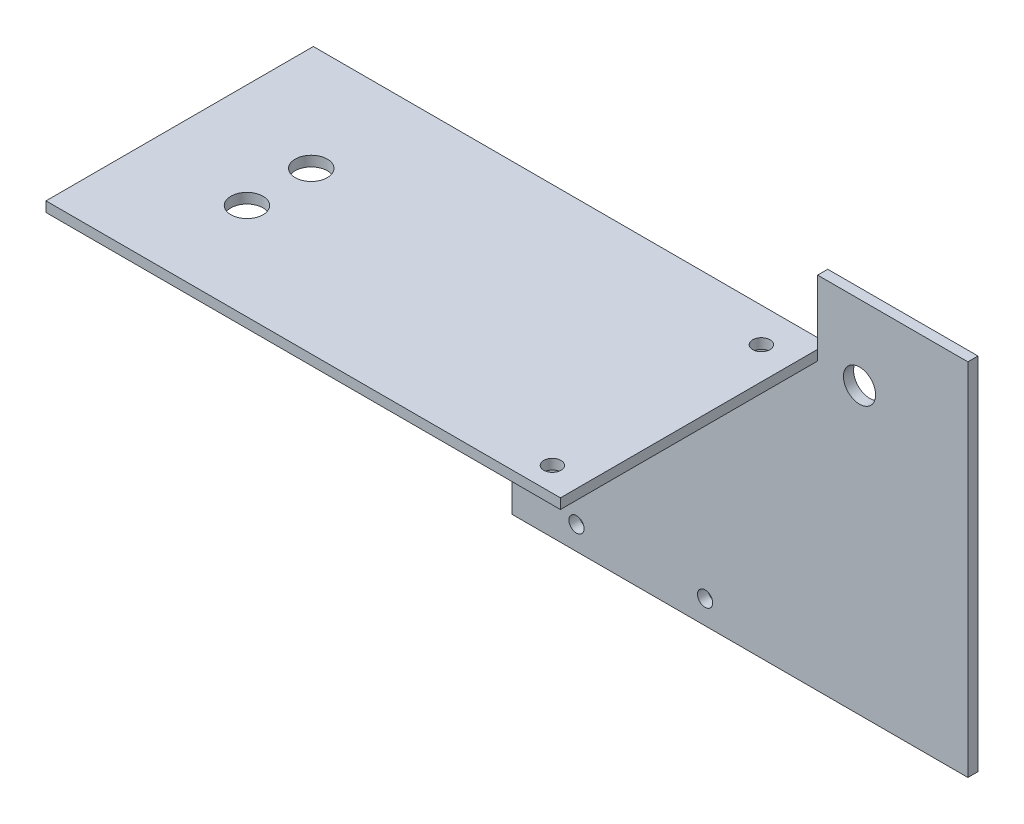
ISO-10303-21;
HEADER;
FILE_DESCRIPTION(('STEP AP214'),'2;1');
FILE_NAME('part.step','',(''),(''),'','','');
FILE_SCHEMA(('AUTOMOTIVE_DESIGN { 1 0 10303 214 1 1 1 1 }'));
ENDSEC;
DATA;
#1=APPLICATION_CONTEXT('core data for automotive mechanical design processes');
#2=APPLICATION_PROTOCOL_DEFINITION('international standard','automotive_design',2000,#1);
#3=PRODUCT_CONTEXT('',#1,'mechanical');
#4=PRODUCT('Part','Part','',(#3));
#5=PRODUCT_RELATED_PRODUCT_CATEGORY('part','',(#4));
#6=PRODUCT_DEFINITION_FORMATION('','',#4);
#7=PRODUCT_DEFINITION_CONTEXT('part definition',#1,'design');
#8=PRODUCT_DEFINITION('design','',#6,#7);
#9=PRODUCT_DEFINITION_SHAPE('','',#8);
#10=(LENGTH_UNIT() NAMED_UNIT(*) SI_UNIT(.MILLI.,.METRE.));
#11=(NAMED_UNIT(*) PLANE_ANGLE_UNIT() SI_UNIT($,.RADIAN.));
#12=(NAMED_UNIT(*) SI_UNIT($,.STERADIAN.) SOLID_ANGLE_UNIT());
#13=UNCERTAINTY_MEASURE_WITH_UNIT(LENGTH_MEASURE(1.E-05),#10,'distance_accuracy_value','');
#14=(GEOMETRIC_REPRESENTATION_CONTEXT(3) GLOBAL_UNCERTAINTY_ASSIGNED_CONTEXT((#13)) GLOBAL_UNIT_ASSIGNED_CONTEXT((#10,
#11,#12)) REPRESENTATION_CONTEXT('',''));
#15=CARTESIAN_POINT('',(0.,0.,0.));
#16=DIRECTION('',(0.,0.,1.));
#17=DIRECTION('',(1.,0.,0.));
#18=AXIS2_PLACEMENT_3D('',#15,#16,#17);
#19=CARTESIAN_POINT('',(0.,58.4,-2.));
#20=DIRECTION('',(-1.,0.,0.));
#21=DIRECTION('',(0.,0.,1.));
#22=AXIS2_PLACEMENT_3D('',#19,#20,#21);
#23=PLANE('',#22);
#24=DIRECTION('',(0.,0.,1.));
#25=VECTOR('',#24,1.);
#26=CARTESIAN_POINT('',(0.,56.4,-2.));
#27=LINE('',#26,#25);
#28=CARTESIAN_POINT('',(0.,56.4,-2.));
#29=VERTEX_POINT('',#28);
#30=CARTESIAN_POINT('',(0.,56.4,0.));
#31=VERTEX_POINT('',#30);
#32=EDGE_CURVE('E50',#29,#31,#27,.T.);
#33=ORIENTED_EDGE('',*,*,#32,.F.);
#34=DIRECTION('',(0.,-1.,0.));
#35=VECTOR('',#34,1.);
#36=CARTESIAN_POINT('',(0.,58.4,-2.));
#37=LINE('',#36,#35);
#38=CARTESIAN_POINT('',(0.,0.,-2.));
#39=VERTEX_POINT('',#38);
#40=EDGE_CURVE('E179',#29,#39,#37,.T.);
#41=ORIENTED_EDGE('',*,*,#40,.T.);
#42=DIRECTION('',(0.,0.,1.));
#43=VECTOR('',#42,1.);
#44=CARTESIAN_POINT('',(0.,0.,-2.));
#45=LINE('',#44,#43);
#46=CARTESIAN_POINT('',(0.,0.,0.));
#47=VERTEX_POINT('',#46);
#48=EDGE_CURVE('E195',#39,#47,#45,.T.);
#49=ORIENTED_EDGE('',*,*,#48,.T.);
#50=DIRECTION('',(0.,-1.,0.));
#51=VECTOR('',#50,1.);
#52=CARTESIAN_POINT('',(0.,58.4,0.));
#53=LINE('',#52,#51);
#54=EDGE_CURVE('E176',#31,#47,#53,.T.);
#55=ORIENTED_EDGE('',*,*,#54,.F.);
#56=EDGE_LOOP('',(#33,#41,#49,#55));
#57=FACE_BOUND('',#56,.T.);
#58=ADVANCED_FACE('F34',(#57),#23,.T.);
#59=CARTESIAN_POINT('',(0.,58.4,-2.));
#60=DIRECTION('',(0.,1.,0.));
#61=DIRECTION('',(0.,0.,1.));
#62=AXIS2_PLACEMENT_3D('',#59,#60,#61);
#63=PLANE('',#62);
#64=CARTESIAN_POINT('',(53.975,58.4,46.0375));
#65=DIRECTION('',(0.,1.,0.));
#66=DIRECTION('',(0.,0.,1.));
#67=AXIS2_PLACEMENT_3D('',#64,#65,#66);
#68=CIRCLE('',#67,1.7);
#69=CARTESIAN_POINT('',(53.975,58.4,47.7375));
#70=VERTEX_POINT('',#69);
#71=EDGE_CURVE('E225',#70,#70,#68,.T.);
#72=ORIENTED_EDGE('',*,*,#71,.F.);
#73=EDGE_LOOP('',(#72));
#74=FACE_BOUND('',#73,.T.);
#75=CARTESIAN_POINT('',(-20.6375,58.4,31.75));
#76=DIRECTION('',(0.,1.,0.));
#77=DIRECTION('',(0.,0.,1.));
#78=AXIS2_PLACEMENT_3D('',#75,#76,#77);
#79=CIRCLE('',#78,3.175);
#80=CARTESIAN_POINT('',(-20.6375,58.4,34.925));
#81=VERTEX_POINT('',#80);
#82=EDGE_CURVE('E239',#81,#81,#79,.T.);
#83=ORIENTED_EDGE('',*,*,#82,.F.);
#84=EDGE_LOOP('',(#83));
#85=FACE_BOUND('',#84,.T.);
#86=CARTESIAN_POINT('',(-20.6375,58.4,19.05));
#87=DIRECTION('',(0.,1.,0.));
#88=DIRECTION('',(0.,0.,1.));
#89=AXIS2_PLACEMENT_3D('',#86,#87,#88);
#90=CIRCLE('',#89,3.175);
#91=CARTESIAN_POINT('',(-20.6375,58.4,22.225));
#92=VERTEX_POINT('',#91);
#93=EDGE_CURVE('E236',#92,#92,#90,.T.);
#94=ORIENTED_EDGE('',*,*,#93,.F.);
#95=EDGE_LOOP('',(#94));
#96=FACE_BOUND('',#95,.T.);
#97=CARTESIAN_POINT('',(53.975,58.4,4.7625));
#98=DIRECTION('',(0.,1.,0.));
#99=DIRECTION('',(0.,0.,1.));
#100=AXIS2_PLACEMENT_3D('',#97,#98,#99);
#101=CIRCLE('',#100,1.7);
#102=CARTESIAN_POINT('',(53.975,58.4,6.4625));
#103=VERTEX_POINT('',#102);
#104=EDGE_CURVE('E221',#103,#103,#101,.T.);
#105=ORIENTED_EDGE('',*,*,#104,.F.);
#106=EDGE_LOOP('',(#105));
#107=FACE_BOUND('',#106,.T.);
#108=DIRECTION('',(-1.,0.,0.));
#109=VECTOR('',#108,1.);
#110=CARTESIAN_POINT('',(0.,58.4,-2.));
#111=LINE('',#110,#109);
#112=CARTESIAN_POINT('',(60.325,58.4,-2.));
#113=VERTEX_POINT('',#112);
#114=CARTESIAN_POINT('',(-41.275,58.4,-2.));
#115=VERTEX_POINT('',#114);
#116=EDGE_CURVE('E193',#113,#115,#111,.T.);
#117=ORIENTED_EDGE('',*,*,#116,.T.);
#118=DIRECTION('',(0.,0.,-1.));
#119=VECTOR('',#118,1.);
#120=CARTESIAN_POINT('',(-41.275,58.4,50.8));
#121=LINE('',#120,#119);
#122=CARTESIAN_POINT('',(-41.275,58.4,50.8));
#123=VERTEX_POINT('',#122);
#124=EDGE_CURVE('E114',#123,#115,#121,.T.);
#125=ORIENTED_EDGE('',*,*,#124,.F.);
#126=DIRECTION('',(1.,0.,0.));
#127=VECTOR('',#126,1.);
#128=CARTESIAN_POINT('',(-41.275,58.4,50.8));
#129=LINE('',#128,#127);
#130=CARTESIAN_POINT('',(60.325,58.4,50.8));
#131=VERTEX_POINT('',#130);
#132=EDGE_CURVE('E109',#123,#131,#129,.T.);
#133=ORIENTED_EDGE('',*,*,#132,.T.);
#134=DIRECTION('',(0.,0.,-1.));
#135=VECTOR('',#134,1.);
#136=CARTESIAN_POINT('',(60.325,58.4,50.8));
#137=LINE('',#136,#135);
#138=CARTESIAN_POINT('',(60.325,58.4,0.));
#139=VERTEX_POINT('',#138);
#140=EDGE_CURVE('E112',#131,#139,#137,.T.);
#141=ORIENTED_EDGE('',*,*,#140,.T.);
#142=DIRECTION('',(0.,0.,1.));
#143=VECTOR('',#142,1.);
#144=CARTESIAN_POINT('',(60.325,58.4,-2.));
#145=LINE('',#144,#143);
#146=EDGE_CURVE('E207',#113,#139,#145,.T.);
#147=ORIENTED_EDGE('',*,*,#146,.F.);
#148=EDGE_LOOP('',(#117,#125,#133,#141,#147));
#149=FACE_BOUND('',#148,.T.);
#150=ADVANCED_FACE('F111',(#74,#85,#96,#107,#149),#63,.T.);
#151=CARTESIAN_POINT('',(60.325,71.1,-2.));
#152=DIRECTION('',(-1.,0.,0.));
#153=DIRECTION('',(0.,0.,1.));
#154=AXIS2_PLACEMENT_3D('',#151,#152,#153);
#155=PLANE('',#154);
#156=DIRECTION('',(0.,-1.,0.));
#157=VECTOR('',#156,1.);
#158=CARTESIAN_POINT('',(60.325,71.1,0.));
#159=LINE('',#158,#157);
#160=CARTESIAN_POINT('',(60.325,71.1,0.));
#161=VERTEX_POINT('',#160);
#162=EDGE_CURVE('E182',#161,#139,#159,.T.);
#163=ORIENTED_EDGE('',*,*,#162,.F.);
#164=DIRECTION('',(0.,0.,1.));
#165=VECTOR('',#164,1.);
#166=CARTESIAN_POINT('',(60.325,71.1,-2.));
#167=LINE('',#166,#165);
#168=CARTESIAN_POINT('',(60.325,71.1,-2.));
#169=VERTEX_POINT('',#168);
#170=EDGE_CURVE('E209',#169,#161,#167,.T.);
#171=ORIENTED_EDGE('',*,*,#170,.F.);
#172=DIRECTION('',(0.,-1.,0.));
#173=VECTOR('',#172,1.);
#174=CARTESIAN_POINT('',(60.325,71.1,-2.));
#175=LINE('',#174,#173);
#176=EDGE_CURVE('E190',#169,#113,#175,.T.);
#177=ORIENTED_EDGE('',*,*,#176,.T.);
#178=ORIENTED_EDGE('',*,*,#146,.T.);
#179=EDGE_LOOP('',(#163,#171,#177,#178));
#180=FACE_BOUND('',#179,.T.);
#181=ADVANCED_FACE('F249',(#180),#155,.T.);
#182=CARTESIAN_POINT('',(90.,71.1,-2.));
#183=DIRECTION('',(0.,1.,0.));
#184=DIRECTION('',(0.,0.,1.));
#185=AXIS2_PLACEMENT_3D('',#182,#183,#184);
#186=PLANE('',#185);
#187=DIRECTION('',(-1.,0.,0.));
#188=VECTOR('',#187,1.);
#189=CARTESIAN_POINT('',(90.,71.1,0.));
#190=LINE('',#189,#188);
#191=CARTESIAN_POINT('',(90.,71.1,0.));
#192=VERTEX_POINT('',#191);
#193=EDGE_CURVE('E203',#192,#161,#190,.T.);
#194=ORIENTED_EDGE('',*,*,#193,.F.);
#195=DIRECTION('',(0.,0.,1.));
#196=VECTOR('',#195,1.);
#197=CARTESIAN_POINT('',(90.,71.1,-2.));
#198=LINE('',#197,#196);
#199=CARTESIAN_POINT('',(90.,71.1,-2.));
#200=VERTEX_POINT('',#199);
#201=EDGE_CURVE('E211',#200,#192,#198,.T.);
#202=ORIENTED_EDGE('',*,*,#201,.F.);
#203=DIRECTION('',(-1.,0.,0.));
#204=VECTOR('',#203,1.);
#205=CARTESIAN_POINT('',(90.,71.1,-2.));
#206=LINE('',#205,#204);
#207=EDGE_CURVE('E187',#200,#169,#206,.T.);
#208=ORIENTED_EDGE('',*,*,#207,.T.);
#209=ORIENTED_EDGE('',*,*,#170,.T.);
#210=EDGE_LOOP('',(#194,#202,#208,#209));
#211=FACE_BOUND('',#210,.T.);
#212=ADVANCED_FACE('F285',(#211),#186,.T.);
#213=CARTESIAN_POINT('',(90.,58.4,-2.));
#214=DIRECTION('',(1.,0.,0.));
#215=DIRECTION('',(0.,1.,0.));
#216=AXIS2_PLACEMENT_3D('',#213,#214,#215);
#217=PLANE('',#216);
#218=DIRECTION('',(0.,1.,0.));
#219=VECTOR('',#218,1.);
#220=CARTESIAN_POINT('',(90.,58.4,0.));
#221=LINE('',#220,#219);
#222=CARTESIAN_POINT('',(90.,0.,0.));
#223=VERTEX_POINT('',#222);
#224=EDGE_CURVE('E200',#223,#192,#221,.T.);
#225=ORIENTED_EDGE('',*,*,#224,.F.);
#226=DIRECTION('',(0.,0.,1.));
#227=VECTOR('',#226,1.);
#228=CARTESIAN_POINT('',(90.,0.,-2.));
#229=LINE('',#228,#227);
#230=CARTESIAN_POINT('',(90.,0.,-2.));
#231=VERTEX_POINT('',#230);
#232=EDGE_CURVE('E213',#231,#223,#229,.T.);
#233=ORIENTED_EDGE('',*,*,#232,.F.);
#234=DIRECTION('',(0.,1.,0.));
#235=VECTOR('',#234,1.);
#236=CARTESIAN_POINT('',(90.,58.4,-2.));
#237=LINE('',#236,#235);
#238=EDGE_CURVE('E185',#231,#200,#237,.T.);
#239=ORIENTED_EDGE('',*,*,#238,.T.);
#240=ORIENTED_EDGE('',*,*,#201,.T.);
#241=EDGE_LOOP('',(#225,#233,#239,#240));
#242=FACE_BOUND('',#241,.T.);
#243=ADVANCED_FACE('F294',(#242),#217,.T.);
#244=CARTESIAN_POINT('',(0.,0.,-2.));
#245=DIRECTION('',(0.,-1.,0.));
#246=DIRECTION('',(0.,0.,-1.));
#247=AXIS2_PLACEMENT_3D('',#244,#245,#246);
#248=PLANE('',#247);
#249=DIRECTION('',(1.,0.,0.));
#250=VECTOR('',#249,1.);
#251=CARTESIAN_POINT('',(0.,0.,0.));
#252=LINE('',#251,#250);
#253=EDGE_CURVE('E197',#47,#223,#252,.T.);
#254=ORIENTED_EDGE('',*,*,#253,.F.);
#255=ORIENTED_EDGE('',*,*,#48,.F.);
#256=DIRECTION('',(1.,0.,0.));
#257=VECTOR('',#256,1.);
#258=CARTESIAN_POINT('',(0.,0.,-2.));
#259=LINE('',#258,#257);
#260=EDGE_CURVE('E181',#39,#231,#259,.T.);
#261=ORIENTED_EDGE('',*,*,#260,.T.);
#262=ORIENTED_EDGE('',*,*,#232,.T.);
#263=EDGE_LOOP('',(#254,#255,#261,#262));
#264=FACE_BOUND('',#263,.T.);
#265=ADVANCED_FACE('F302',(#264),#248,.T.);
#266=CARTESIAN_POINT('',(0.,0.,-2.));
#267=DIRECTION('',(0.,0.,1.));
#268=DIRECTION('',(1.,0.,0.));
#269=AXIS2_PLACEMENT_3D('',#266,#267,#268);
#270=PLANE('',#269);
#271=CARTESIAN_POINT('',(38.1,4.65,-2.));
#272=DIRECTION('',(0.,0.,1.));
#273=DIRECTION('',(1.,0.,0.));
#274=AXIS2_PLACEMENT_3D('',#271,#272,#273);
#275=CIRCLE('',#274,1.50000000000001);
#276=CARTESIAN_POINT('',(39.6,4.65,-2.));
#277=VERTEX_POINT('',#276);
#278=EDGE_CURVE('E149',#277,#277,#275,.T.);
#279=ORIENTED_EDGE('',*,*,#278,.T.);
#280=EDGE_LOOP('',(#279));
#281=FACE_BOUND('',#280,.T.);
#282=CARTESIAN_POINT('',(12.7,4.64999999999999,-2.));
#283=DIRECTION('',(0.,0.,1.));
#284=DIRECTION('',(1.,0.,0.));
#285=AXIS2_PLACEMENT_3D('',#282,#283,#284);
#286=CIRCLE('',#285,1.5);
#287=CARTESIAN_POINT('',(14.2,4.64999999999999,-2.));
#288=VERTEX_POINT('',#287);
#289=EDGE_CURVE('E155',#288,#288,#286,.T.);
#290=ORIENTED_EDGE('',*,*,#289,.T.);
#291=EDGE_LOOP('',(#290));
#292=FACE_BOUND('',#291,.T.);
#293=CARTESIAN_POINT('',(38.1,51.75,-2.));
#294=DIRECTION('',(0.,0.,1.));
#295=DIRECTION('',(1.,0.,0.));
#296=AXIS2_PLACEMENT_3D('',#293,#294,#295);
#297=CIRCLE('',#296,1.50000000000001);
#298=CARTESIAN_POINT('',(39.6,51.75,-2.));
#299=VERTEX_POINT('',#298);
#300=EDGE_CURVE('E161',#299,#299,#297,.T.);
#301=ORIENTED_EDGE('',*,*,#300,.T.);
#302=EDGE_LOOP('',(#301));
#303=FACE_BOUND('',#302,.T.);
#304=CARTESIAN_POINT('',(12.7,51.75,-2.));
#305=DIRECTION('',(0.,0.,1.));
#306=DIRECTION('',(1.,0.,0.));
#307=AXIS2_PLACEMENT_3D('',#304,#305,#306);
#308=CIRCLE('',#307,1.5);
#309=CARTESIAN_POINT('',(14.2,51.75,-2.));
#310=VERTEX_POINT('',#309);
#311=EDGE_CURVE('E167',#310,#310,#308,.T.);
#312=ORIENTED_EDGE('',*,*,#311,.T.);
#313=EDGE_LOOP('',(#312));
#314=FACE_BOUND('',#313,.T.);
#315=CARTESIAN_POINT('',(68.6,56.33204182,-2.));
#316=DIRECTION('',(0.,0.,1.));
#317=DIRECTION('',(1.,0.,0.));
#318=AXIS2_PLACEMENT_3D('',#315,#316,#317);
#319=CIRCLE('',#318,3.175);
#320=CARTESIAN_POINT('',(71.775,56.33204182,-2.));
#321=VERTEX_POINT('',#320);
#322=EDGE_CURVE('E173',#321,#321,#319,.T.);
#323=ORIENTED_EDGE('',*,*,#322,.T.);
#324=EDGE_LOOP('',(#323));
#325=FACE_BOUND('',#324,.T.);
#326=ORIENTED_EDGE('',*,*,#40,.F.);
#327=DIRECTION('',(-1.,0.,0.));
#328=VECTOR('',#327,1.);
#329=CARTESIAN_POINT('',(0.,56.4,-2.));
#330=LINE('',#329,#328);
#331=CARTESIAN_POINT('',(-41.275,56.4,-2.));
#332=VERTEX_POINT('',#331);
#333=EDGE_CURVE('E137',#29,#332,#330,.T.);
#334=ORIENTED_EDGE('',*,*,#333,.T.);
#335=DIRECTION('',(0.,1.,0.));
#336=VECTOR('',#335,1.);
#337=CARTESIAN_POINT('',(-41.275,56.4,-2.));
#338=LINE('',#337,#336);
#339=EDGE_CURVE('E120',#332,#115,#338,.T.);
#340=ORIENTED_EDGE('',*,*,#339,.T.);
#341=ORIENTED_EDGE('',*,*,#116,.F.);
#342=ORIENTED_EDGE('',*,*,#176,.F.);
#343=ORIENTED_EDGE('',*,*,#207,.F.);
#344=ORIENTED_EDGE('',*,*,#238,.F.);
#345=ORIENTED_EDGE('',*,*,#260,.F.);
#346=EDGE_LOOP('',(#326,#334,#340,#341,#342,#343,#344,#345));
#347=FACE_BOUND('',#346,.T.);
#348=ADVANCED_FACE('F310',(#281,#292,#303,#314,#325,#347),#270,.F.);
#349=CARTESIAN_POINT('',(0.,0.,0.));
#350=DIRECTION('',(0.,0.,1.));
#351=DIRECTION('',(1.,0.,0.));
#352=AXIS2_PLACEMENT_3D('',#349,#350,#351);
#353=PLANE('',#352);
#354=DIRECTION('',(1.,0.,0.));
#355=VECTOR('',#354,1.);
#356=CARTESIAN_POINT('',(0.,56.4,0.));
#357=LINE('',#356,#355);
#358=CARTESIAN_POINT('',(60.325,56.4,0.));
#359=VERTEX_POINT('',#358);
#360=EDGE_CURVE('E11',#31,#359,#357,.T.);
#361=ORIENTED_EDGE('',*,*,#360,.F.);
#362=ORIENTED_EDGE('',*,*,#54,.T.);
#363=ORIENTED_EDGE('',*,*,#253,.T.);
#364=ORIENTED_EDGE('',*,*,#224,.T.);
#365=ORIENTED_EDGE('',*,*,#193,.T.);
#366=ORIENTED_EDGE('',*,*,#162,.T.);
#367=DIRECTION('',(0.,1.,0.));
#368=VECTOR('',#367,1.);
#369=CARTESIAN_POINT('',(60.325,0.,0.));
#370=LINE('',#369,#368);
#371=EDGE_CURVE('E42',#359,#139,#370,.T.);
#372=ORIENTED_EDGE('',*,*,#371,.F.);
#373=EDGE_LOOP('',(#361,#362,#363,#364,#365,#366,#372));
#374=FACE_BOUND('',#373,.T.);
#375=CARTESIAN_POINT('',(38.1,4.65,0.));
#376=DIRECTION('',(0.,0.,1.));
#377=DIRECTION('',(1.,0.,0.));
#378=AXIS2_PLACEMENT_3D('',#375,#376,#377);
#379=CIRCLE('',#378,1.50000000000001);
#380=CARTESIAN_POINT('',(39.6,4.65,0.));
#381=VERTEX_POINT('',#380);
#382=EDGE_CURVE('E148',#381,#381,#379,.T.);
#383=ORIENTED_EDGE('',*,*,#382,.F.);
#384=EDGE_LOOP('',(#383));
#385=FACE_BOUND('',#384,.T.);
#386=CARTESIAN_POINT('',(12.7,4.64999999999999,0.));
#387=DIRECTION('',(0.,0.,1.));
#388=DIRECTION('',(1.,0.,0.));
#389=AXIS2_PLACEMENT_3D('',#386,#387,#388);
#390=CIRCLE('',#389,1.5);
#391=CARTESIAN_POINT('',(14.2,4.64999999999999,0.));
#392=VERTEX_POINT('',#391);
#393=EDGE_CURVE('E152',#392,#392,#390,.T.);
#394=ORIENTED_EDGE('',*,*,#393,.F.);
#395=EDGE_LOOP('',(#394));
#396=FACE_BOUND('',#395,.T.);
#397=CARTESIAN_POINT('',(38.1,51.75,0.));
#398=DIRECTION('',(0.,0.,1.));
#399=DIRECTION('',(1.,0.,0.));
#400=AXIS2_PLACEMENT_3D('',#397,#398,#399);
#401=CIRCLE('',#400,1.50000000000001);
#402=CARTESIAN_POINT('',(39.6,51.75,0.));
#403=VERTEX_POINT('',#402);
#404=EDGE_CURVE('E158',#403,#403,#401,.T.);
#405=ORIENTED_EDGE('',*,*,#404,.F.);
#406=EDGE_LOOP('',(#405));
#407=FACE_BOUND('',#406,.T.);
#408=CARTESIAN_POINT('',(12.7,51.75,0.));
#409=DIRECTION('',(0.,0.,1.));
#410=DIRECTION('',(1.,0.,0.));
#411=AXIS2_PLACEMENT_3D('',#408,#409,#410);
#412=CIRCLE('',#411,1.5);
#413=CARTESIAN_POINT('',(14.2,51.75,0.));
#414=VERTEX_POINT('',#413);
#415=EDGE_CURVE('E164',#414,#414,#412,.T.);
#416=ORIENTED_EDGE('',*,*,#415,.F.);
#417=EDGE_LOOP('',(#416));
#418=FACE_BOUND('',#417,.T.);
#419=CARTESIAN_POINT('',(68.6,56.33204182,0.));
#420=DIRECTION('',(0.,0.,1.));
#421=DIRECTION('',(1.,0.,0.));
#422=AXIS2_PLACEMENT_3D('',#419,#420,#421);
#423=CIRCLE('',#422,3.175);
#424=CARTESIAN_POINT('',(71.775,56.33204182,0.));
#425=VERTEX_POINT('',#424);
#426=EDGE_CURVE('E170',#425,#425,#423,.T.);
#427=ORIENTED_EDGE('',*,*,#426,.F.);
#428=EDGE_LOOP('',(#427));
#429=FACE_BOUND('',#428,.T.);
#430=ADVANCED_FACE('F317',(#374,#385,#396,#407,#418,#429),#353,.T.);
#431=CARTESIAN_POINT('',(68.6,56.33204182,-2.));
#432=DIRECTION('',(0.,0.,1.));
#433=DIRECTION('',(1.,0.,0.));
#434=AXIS2_PLACEMENT_3D('',#431,#432,#433);
#435=CYLINDRICAL_SURFACE('',#434,3.175);
#436=ORIENTED_EDGE('',*,*,#322,.F.);
#437=EDGE_LOOP('',(#436));
#438=FACE_BOUND('',#437,.T.);
#439=ORIENTED_EDGE('',*,*,#426,.T.);
#440=EDGE_LOOP('',(#439));
#441=FACE_BOUND('',#440,.T.);
#442=ADVANCED_FACE('F325',(#438,#441),#435,.F.);
#443=CARTESIAN_POINT('',(12.7,51.75,-2.));
#444=DIRECTION('',(0.,0.,1.));
#445=DIRECTION('',(1.,0.,0.));
#446=AXIS2_PLACEMENT_3D('',#443,#444,#445);
#447=CYLINDRICAL_SURFACE('',#446,1.5);
#448=ORIENTED_EDGE('',*,*,#311,.F.);
#449=EDGE_LOOP('',(#448));
#450=FACE_BOUND('',#449,.T.);
#451=ORIENTED_EDGE('',*,*,#415,.T.);
#452=EDGE_LOOP('',(#451));
#453=FACE_BOUND('',#452,.T.);
#454=ADVANCED_FACE('F332',(#450,#453),#447,.F.);
#455=CARTESIAN_POINT('',(38.1,51.75,-2.));
#456=DIRECTION('',(0.,0.,1.));
#457=DIRECTION('',(1.,0.,0.));
#458=AXIS2_PLACEMENT_3D('',#455,#456,#457);
#459=CYLINDRICAL_SURFACE('',#458,1.50000000000001);
#460=ORIENTED_EDGE('',*,*,#300,.F.);
#461=EDGE_LOOP('',(#460));
#462=FACE_BOUND('',#461,.T.);
#463=ORIENTED_EDGE('',*,*,#404,.T.);
#464=EDGE_LOOP('',(#463));
#465=FACE_BOUND('',#464,.T.);
#466=ADVANCED_FACE('F340',(#462,#465),#459,.F.);
#467=CARTESIAN_POINT('',(12.7,4.64999999999999,-2.));
#468=DIRECTION('',(0.,0.,1.));
#469=DIRECTION('',(1.,0.,0.));
#470=AXIS2_PLACEMENT_3D('',#467,#468,#469);
#471=CYLINDRICAL_SURFACE('',#470,1.5);
#472=ORIENTED_EDGE('',*,*,#289,.F.);
#473=EDGE_LOOP('',(#472));
#474=FACE_BOUND('',#473,.T.);
#475=ORIENTED_EDGE('',*,*,#393,.T.);
#476=EDGE_LOOP('',(#475));
#477=FACE_BOUND('',#476,.T.);
#478=ADVANCED_FACE('F348',(#474,#477),#471,.F.);
#479=CARTESIAN_POINT('',(38.1,4.65,-2.));
#480=DIRECTION('',(0.,0.,1.));
#481=DIRECTION('',(1.,0.,0.));
#482=AXIS2_PLACEMENT_3D('',#479,#480,#481);
#483=CYLINDRICAL_SURFACE('',#482,1.50000000000001);
#484=ORIENTED_EDGE('',*,*,#278,.F.);
#485=EDGE_LOOP('',(#484));
#486=FACE_BOUND('',#485,.T.);
#487=ORIENTED_EDGE('',*,*,#382,.T.);
#488=EDGE_LOOP('',(#487));
#489=FACE_BOUND('',#488,.T.);
#490=ADVANCED_FACE('F356',(#486,#489),#483,.F.);
#491=CARTESIAN_POINT('',(-41.275,56.4,50.8));
#492=DIRECTION('',(-1.,0.,0.));
#493=DIRECTION('',(0.,0.,1.));
#494=AXIS2_PLACEMENT_3D('',#491,#492,#493);
#495=PLANE('',#494);
#496=ORIENTED_EDGE('',*,*,#339,.F.);
#497=DIRECTION('',(0.,0.,-1.));
#498=VECTOR('',#497,1.);
#499=CARTESIAN_POINT('',(-41.275,56.4,50.8));
#500=LINE('',#499,#498);
#501=CARTESIAN_POINT('',(-41.275,56.4,50.8));
#502=VERTEX_POINT('',#501);
#503=EDGE_CURVE('E143',#502,#332,#500,.T.);
#504=ORIENTED_EDGE('',*,*,#503,.F.);
#505=DIRECTION('',(0.,1.,0.));
#506=VECTOR('',#505,1.);
#507=CARTESIAN_POINT('',(-41.275,56.4,50.8));
#508=LINE('',#507,#506);
#509=EDGE_CURVE('E127',#502,#123,#508,.T.);
#510=ORIENTED_EDGE('',*,*,#509,.T.);
#511=ORIENTED_EDGE('',*,*,#124,.T.);
#512=EDGE_LOOP('',(#496,#504,#510,#511));
#513=FACE_BOUND('',#512,.T.);
#514=ADVANCED_FACE('F363',(#513),#495,.T.);
#515=CARTESIAN_POINT('',(0.,56.4,50.8));
#516=DIRECTION('',(0.,-1.,0.));
#517=DIRECTION('',(0.,0.,-1.));
#518=AXIS2_PLACEMENT_3D('',#515,#516,#517);
#519=PLANE('',#518);
#520=CARTESIAN_POINT('',(53.975,56.4,46.0375));
#521=DIRECTION('',(0.,-1.,0.));
#522=DIRECTION('',(0.,0.,-1.));
#523=AXIS2_PLACEMENT_3D('',#520,#521,#522);
#524=CIRCLE('',#523,1.7);
#525=CARTESIAN_POINT('',(53.975,56.4,44.3375));
#526=VERTEX_POINT('',#525);
#527=EDGE_CURVE('E37',#526,#526,#524,.T.);
#528=ORIENTED_EDGE('',*,*,#527,.F.);
#529=EDGE_LOOP('',(#528));
#530=FACE_BOUND('',#529,.T.);
#531=CARTESIAN_POINT('',(-20.6375,56.4,31.75));
#532=DIRECTION('',(0.,-1.,0.));
#533=DIRECTION('',(0.,0.,-1.));
#534=AXIS2_PLACEMENT_3D('',#531,#532,#533);
#535=CIRCLE('',#534,3.175);
#536=CARTESIAN_POINT('',(-20.6375,56.4,28.575));
#537=VERTEX_POINT('',#536);
#538=EDGE_CURVE('E224',#537,#537,#535,.T.);
#539=ORIENTED_EDGE('',*,*,#538,.F.);
#540=EDGE_LOOP('',(#539));
#541=FACE_BOUND('',#540,.T.);
#542=CARTESIAN_POINT('',(-20.6375,56.4,19.05));
#543=DIRECTION('',(0.,-1.,0.));
#544=DIRECTION('',(0.,0.,-1.));
#545=AXIS2_PLACEMENT_3D('',#542,#543,#544);
#546=CIRCLE('',#545,3.175);
#547=CARTESIAN_POINT('',(-20.6375,56.4,15.875));
#548=VERTEX_POINT('',#547);
#549=EDGE_CURVE('E222',#548,#548,#546,.T.);
#550=ORIENTED_EDGE('',*,*,#549,.F.);
#551=EDGE_LOOP('',(#550));
#552=FACE_BOUND('',#551,.T.);
#553=CARTESIAN_POINT('',(53.975,56.4,4.7625));
#554=DIRECTION('',(0.,-1.,0.));
#555=DIRECTION('',(0.,0.,-1.));
#556=AXIS2_PLACEMENT_3D('',#553,#554,#555);
#557=CIRCLE('',#556,1.7);
#558=CARTESIAN_POINT('',(53.975,56.4,3.0625));
#559=VERTEX_POINT('',#558);
#560=EDGE_CURVE('E139',#559,#559,#557,.T.);
#561=ORIENTED_EDGE('',*,*,#560,.F.);
#562=EDGE_LOOP('',(#561));
#563=FACE_BOUND('',#562,.T.);
#564=ORIENTED_EDGE('',*,*,#333,.F.);
#565=ORIENTED_EDGE('',*,*,#32,.T.);
#566=ORIENTED_EDGE('',*,*,#360,.T.);
#567=DIRECTION('',(0.,0.,-1.));
#568=VECTOR('',#567,1.);
#569=CARTESIAN_POINT('',(60.325,56.4,50.8));
#570=LINE('',#569,#568);
#571=CARTESIAN_POINT('',(60.325,56.4,50.8));
#572=VERTEX_POINT('',#571);
#573=EDGE_CURVE('E126',#572,#359,#570,.T.);
#574=ORIENTED_EDGE('',*,*,#573,.F.);
#575=DIRECTION('',(-1.,0.,0.));
#576=VECTOR('',#575,1.);
#577=CARTESIAN_POINT('',(0.,56.4,50.8));
#578=LINE('',#577,#576);
#579=EDGE_CURVE('E131',#572,#502,#578,.T.);
#580=ORIENTED_EDGE('',*,*,#579,.T.);
#581=ORIENTED_EDGE('',*,*,#503,.T.);
#582=EDGE_LOOP('',(#564,#565,#566,#574,#580,#581));
#583=FACE_BOUND('',#582,.T.);
#584=ADVANCED_FACE('F370',(#530,#541,#552,#563,#583),#519,.T.);
#585=CARTESIAN_POINT('',(60.325,56.4,50.8));
#586=DIRECTION('',(1.,0.,0.));
#587=DIRECTION('',(0.,0.,-1.));
#588=AXIS2_PLACEMENT_3D('',#585,#586,#587);
#589=PLANE('',#588);
#590=ORIENTED_EDGE('',*,*,#573,.T.);
#591=ORIENTED_EDGE('',*,*,#371,.T.);
#592=ORIENTED_EDGE('',*,*,#140,.F.);
#593=DIRECTION('',(0.,-1.,0.));
#594=VECTOR('',#593,1.);
#595=CARTESIAN_POINT('',(60.325,56.4,50.8));
#596=LINE('',#595,#594);
#597=EDGE_CURVE('E119',#131,#572,#596,.T.);
#598=ORIENTED_EDGE('',*,*,#597,.T.);
#599=EDGE_LOOP('',(#590,#591,#592,#598));
#600=FACE_BOUND('',#599,.T.);
#601=ADVANCED_FACE('F125',(#600),#589,.T.);
#602=CARTESIAN_POINT('',(0.,0.,50.8));
#603=DIRECTION('',(0.,0.,1.));
#604=DIRECTION('',(1.,0.,0.));
#605=AXIS2_PLACEMENT_3D('',#602,#603,#604);
#606=PLANE('',#605);
#607=ORIENTED_EDGE('',*,*,#132,.F.);
#608=ORIENTED_EDGE('',*,*,#509,.F.);
#609=ORIENTED_EDGE('',*,*,#579,.F.);
#610=ORIENTED_EDGE('',*,*,#597,.F.);
#611=EDGE_LOOP('',(#607,#608,#609,#610));
#612=FACE_BOUND('',#611,.T.);
#613=ADVANCED_FACE('F130',(#612),#606,.T.);
#614=CARTESIAN_POINT('',(53.975,0.,4.7625));
#615=DIRECTION('',(0.,1.,0.));
#616=DIRECTION('',(0.,0.,1.));
#617=AXIS2_PLACEMENT_3D('',#614,#615,#616);
#618=CYLINDRICAL_SURFACE('',#617,1.7);
#619=ORIENTED_EDGE('',*,*,#560,.T.);
#620=EDGE_LOOP('',(#619));
#621=FACE_BOUND('',#620,.T.);
#622=ORIENTED_EDGE('',*,*,#104,.T.);
#623=EDGE_LOOP('',(#622));
#624=FACE_BOUND('',#623,.T.);
#625=ADVANCED_FACE('F259',(#621,#624),#618,.F.);
#626=CARTESIAN_POINT('',(-20.6375,0.,19.05));
#627=DIRECTION('',(0.,1.,0.));
#628=DIRECTION('',(0.,0.,1.));
#629=AXIS2_PLACEMENT_3D('',#626,#627,#628);
#630=CYLINDRICAL_SURFACE('',#629,3.175);
#631=ORIENTED_EDGE('',*,*,#549,.T.);
#632=EDGE_LOOP('',(#631));
#633=FACE_BOUND('',#632,.T.);
#634=ORIENTED_EDGE('',*,*,#93,.T.);
#635=EDGE_LOOP('',(#634));
#636=FACE_BOUND('',#635,.T.);
#637=ADVANCED_FACE('F256',(#633,#636),#630,.F.);
#638=CARTESIAN_POINT('',(-20.6375,0.,31.75));
#639=DIRECTION('',(0.,1.,0.));
#640=DIRECTION('',(0.,0.,1.));
#641=AXIS2_PLACEMENT_3D('',#638,#639,#640);
#642=CYLINDRICAL_SURFACE('',#641,3.175);
#643=ORIENTED_EDGE('',*,*,#538,.T.);
#644=EDGE_LOOP('',(#643));
#645=FACE_BOUND('',#644,.T.);
#646=ORIENTED_EDGE('',*,*,#82,.T.);
#647=EDGE_LOOP('',(#646));
#648=FACE_BOUND('',#647,.T.);
#649=ADVANCED_FACE('F258',(#645,#648),#642,.F.);
#650=CARTESIAN_POINT('',(53.975,0.,46.0375));
#651=DIRECTION('',(0.,1.,0.));
#652=DIRECTION('',(0.,0.,1.));
#653=AXIS2_PLACEMENT_3D('',#650,#651,#652);
#654=CYLINDRICAL_SURFACE('',#653,1.7);
#655=ORIENTED_EDGE('',*,*,#527,.T.);
#656=EDGE_LOOP('',(#655));
#657=FACE_BOUND('',#656,.T.);
#658=ORIENTED_EDGE('',*,*,#71,.T.);
#659=EDGE_LOOP('',(#658));
#660=FACE_BOUND('',#659,.T.);
#661=ADVANCED_FACE('F245',(#657,#660),#654,.F.);
#662=CLOSED_SHELL('',(#58,#150,#181,#212,#243,#265,#348,#430,#442,#454,#466,#478,#490,#514,#584,
#601,#613,#625,#637,#649,#661));
#663=MANIFOLD_SOLID_BREP('B2',#662);
#664=ADVANCED_BREP_SHAPE_REPRESENTATION('',(#18,#663),#14);
#665=SHAPE_DEFINITION_REPRESENTATION(#9,#664);
ENDSEC;
END-ISO-10303-21;
